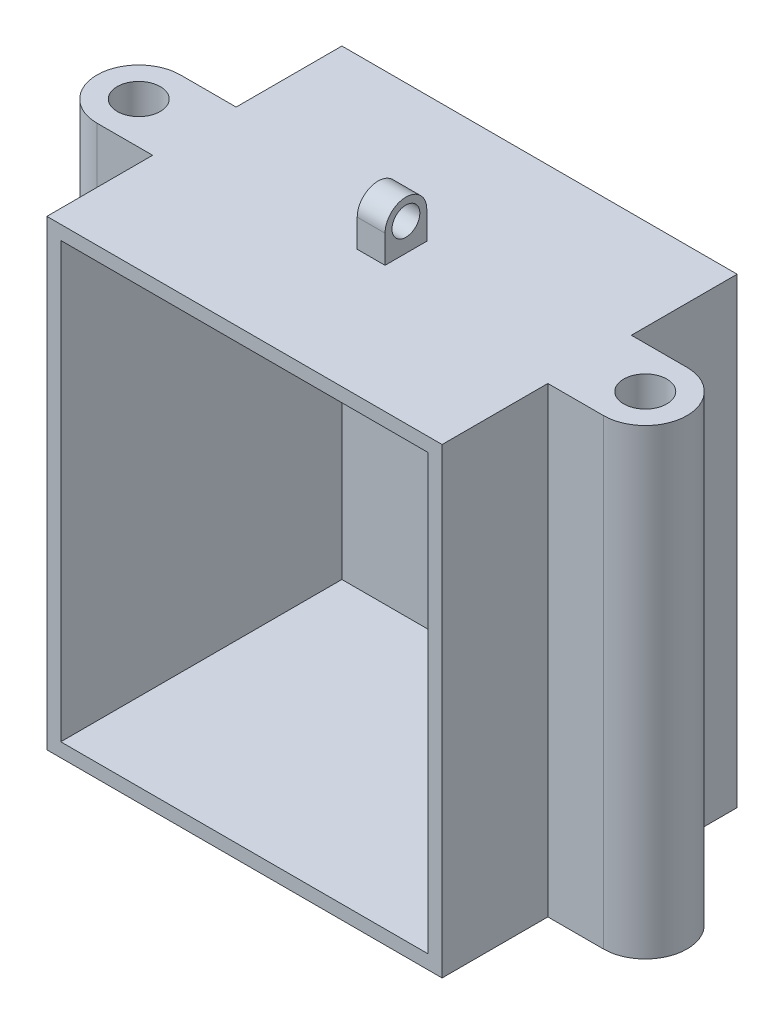
ISO-10303-21;
HEADER;
FILE_DESCRIPTION(('STEP AP214'),'2;1');
FILE_NAME('part.step','',(''),(''),'','','');
FILE_SCHEMA(('AUTOMOTIVE_DESIGN { 1 0 10303 214 1 1 1 1 }'));
ENDSEC;
DATA;
#1=APPLICATION_CONTEXT('core data for automotive mechanical design processes');
#2=APPLICATION_PROTOCOL_DEFINITION('international standard','automotive_design',2000,#1);
#3=PRODUCT_CONTEXT('',#1,'mechanical');
#4=PRODUCT('Part','Part','',(#3));
#5=PRODUCT_RELATED_PRODUCT_CATEGORY('part','',(#4));
#6=PRODUCT_DEFINITION_FORMATION('','',#4);
#7=PRODUCT_DEFINITION_CONTEXT('part definition',#1,'design');
#8=PRODUCT_DEFINITION('design','',#6,#7);
#9=PRODUCT_DEFINITION_SHAPE('','',#8);
#10=(LENGTH_UNIT() NAMED_UNIT(*) SI_UNIT(.MILLI.,.METRE.));
#11=(NAMED_UNIT(*) PLANE_ANGLE_UNIT() SI_UNIT($,.RADIAN.));
#12=(NAMED_UNIT(*) SI_UNIT($,.STERADIAN.) SOLID_ANGLE_UNIT());
#13=UNCERTAINTY_MEASURE_WITH_UNIT(LENGTH_MEASURE(1.E-05),#10,'distance_accuracy_value','');
#14=(GEOMETRIC_REPRESENTATION_CONTEXT(3) GLOBAL_UNCERTAINTY_ASSIGNED_CONTEXT((#13)) GLOBAL_UNIT_ASSIGNED_CONTEXT((#10,
#11,#12)) REPRESENTATION_CONTEXT('',''));
#15=CARTESIAN_POINT('',(0.,0.,0.));
#16=DIRECTION('',(0.,0.,1.));
#17=DIRECTION('',(1.,0.,0.));
#18=AXIS2_PLACEMENT_3D('',#15,#16,#17);
#19=CARTESIAN_POINT('',(0.,166.,106.));
#20=DIRECTION('',(0.,-1.,0.));
#21=DIRECTION('',(0.,0.,-1.));
#22=AXIS2_PLACEMENT_3D('',#19,#20,#21);
#23=PLANE('',#22);
#24=CARTESIAN_POINT('',(162.,166.,53.));
#25=DIRECTION('',(0.,1.,0.));
#26=DIRECTION('',(0.,0.,1.));
#27=AXIS2_PLACEMENT_3D('',#24,#25,#26);
#28=CIRCLE('',#27,7.75);
#29=CARTESIAN_POINT('',(162.,166.,60.75));
#30=VERTEX_POINT('',#29);
#31=EDGE_CURVE('E278',#30,#30,#28,.T.);
#32=ORIENTED_EDGE('',*,*,#31,.F.);
#33=EDGE_LOOP('',(#32));
#34=FACE_BOUND('',#33,.T.);
#35=CARTESIAN_POINT('',(-20.,166.,53.));
#36=DIRECTION('',(0.,1.,0.));
#37=DIRECTION('',(0.,0.,1.));
#38=AXIS2_PLACEMENT_3D('',#35,#36,#37);
#39=CIRCLE('',#38,7.75);
#40=CARTESIAN_POINT('',(-20.,166.,60.75));
#41=VERTEX_POINT('',#40);
#42=EDGE_CURVE('E306',#41,#41,#39,.T.);
#43=ORIENTED_EDGE('',*,*,#42,.F.);
#44=EDGE_LOOP('',(#43));
#45=FACE_BOUND('',#44,.T.);
#46=DIRECTION('',(-1.,0.,0.));
#47=VECTOR('',#46,1.);
#48=CARTESIAN_POINT('',(0.,166.,0.));
#49=LINE('',#48,#47);
#50=CARTESIAN_POINT('',(142.,166.,0.));
#51=VERTEX_POINT('',#50);
#52=CARTESIAN_POINT('',(0.,166.,0.));
#53=VERTEX_POINT('',#52);
#54=EDGE_CURVE('E404',#51,#53,#49,.T.);
#55=ORIENTED_EDGE('',*,*,#54,.T.);
#56=DIRECTION('',(0.,0.,-1.));
#57=VECTOR('',#56,1.);
#58=CARTESIAN_POINT('',(0.,166.,106.));
#59=LINE('',#58,#57);
#60=CARTESIAN_POINT('',(0.,166.,38.));
#61=VERTEX_POINT('',#60);
#62=EDGE_CURVE('E413',#61,#53,#59,.T.);
#63=ORIENTED_EDGE('',*,*,#62,.F.);
#64=DIRECTION('',(1.,0.,0.));
#65=VECTOR('',#64,1.);
#66=CARTESIAN_POINT('',(0.,166.,38.));
#67=LINE('',#66,#65);
#68=CARTESIAN_POINT('',(-20.,166.,38.));
#69=VERTEX_POINT('',#68);
#70=EDGE_CURVE('E320',#69,#61,#67,.T.);
#71=ORIENTED_EDGE('',*,*,#70,.F.);
#72=CARTESIAN_POINT('',(-20.,166.,53.));
#73=DIRECTION('',(0.,1.,0.));
#74=DIRECTION('',(0.,0.,1.));
#75=AXIS2_PLACEMENT_3D('',#72,#73,#74);
#76=CIRCLE('',#75,15.);
#77=CARTESIAN_POINT('',(-20.,166.,68.));
#78=VERTEX_POINT('',#77);
#79=EDGE_CURVE('E334',#69,#78,#76,.T.);
#80=ORIENTED_EDGE('',*,*,#79,.T.);
#81=DIRECTION('',(1.,0.,0.));
#82=VECTOR('',#81,1.);
#83=CARTESIAN_POINT('',(0.,166.,68.));
#84=LINE('',#83,#82);
#85=CARTESIAN_POINT('',(0.,166.,68.));
#86=VERTEX_POINT('',#85);
#87=EDGE_CURVE('E338',#78,#86,#84,.T.);
#88=ORIENTED_EDGE('',*,*,#87,.T.);
#89=CARTESIAN_POINT('',(0.,166.,106.));
#90=VERTEX_POINT('',#89);
#91=EDGE_CURVE('E428',#90,#86,#59,.T.);
#92=ORIENTED_EDGE('',*,*,#91,.F.);
#93=DIRECTION('',(-1.,0.,0.));
#94=VECTOR('',#93,1.);
#95=CARTESIAN_POINT('',(0.,166.,106.));
#96=LINE('',#95,#94);
#97=CARTESIAN_POINT('',(142.,166.,106.));
#98=VERTEX_POINT('',#97);
#99=EDGE_CURVE('E410',#98,#90,#96,.T.);
#100=ORIENTED_EDGE('',*,*,#99,.F.);
#101=DIRECTION('',(0.,0.,-1.));
#102=VECTOR('',#101,1.);
#103=CARTESIAN_POINT('',(142.,166.,106.));
#104=LINE('',#103,#102);
#105=CARTESIAN_POINT('',(142.,166.,68.));
#106=VERTEX_POINT('',#105);
#107=EDGE_CURVE('E433',#98,#106,#104,.T.);
#108=ORIENTED_EDGE('',*,*,#107,.T.);
#109=DIRECTION('',(-1.,0.,0.));
#110=VECTOR('',#109,1.);
#111=CARTESIAN_POINT('',(0.,166.,67.9999999999999));
#112=LINE('',#111,#110);
#113=CARTESIAN_POINT('',(162.,166.,68.));
#114=VERTEX_POINT('',#113);
#115=EDGE_CURVE('E101',#114,#106,#112,.T.);
#116=ORIENTED_EDGE('',*,*,#115,.F.);
#117=CARTESIAN_POINT('',(162.,166.,53.));
#118=DIRECTION('',(0.,1.,0.));
#119=DIRECTION('',(0.,0.,1.));
#120=AXIS2_PLACEMENT_3D('',#117,#118,#119);
#121=CIRCLE('',#120,15.);
#122=CARTESIAN_POINT('',(162.,166.,38.));
#123=VERTEX_POINT('',#122);
#124=EDGE_CURVE('E292',#114,#123,#121,.T.);
#125=ORIENTED_EDGE('',*,*,#124,.T.);
#126=DIRECTION('',(-1.,0.,0.));
#127=VECTOR('',#126,1.);
#128=CARTESIAN_POINT('',(0.,166.,38.0000000000001));
#129=LINE('',#128,#127);
#130=CARTESIAN_POINT('',(142.,166.,38.));
#131=VERTEX_POINT('',#130);
#132=EDGE_CURVE('E296',#123,#131,#129,.T.);
#133=ORIENTED_EDGE('',*,*,#132,.T.);
#134=EDGE_CURVE('E432',#131,#51,#104,.T.);
#135=ORIENTED_EDGE('',*,*,#134,.T.);
#136=EDGE_LOOP('',(#55,#63,#71,#80,#88,#92,#100,#108,#116,#125,#133,#135));
#137=FACE_BOUND('',#136,.T.);
#138=DIRECTION('',(0.,0.,1.));
#139=VECTOR('',#138,1.);
#140=CARTESIAN_POINT('',(66.,166.,0.));
#141=LINE('',#140,#139);
#142=CARTESIAN_POINT('',(66.,166.,45.5));
#143=VERTEX_POINT('',#142);
#144=CARTESIAN_POINT('',(66.,166.,60.5));
#145=VERTEX_POINT('',#144);
#146=EDGE_CURVE('E246',#143,#145,#141,.T.);
#147=ORIENTED_EDGE('',*,*,#146,.F.);
#148=DIRECTION('',(-1.,0.,0.));
#149=VECTOR('',#148,1.);
#150=CARTESIAN_POINT('',(76.,166.,45.5));
#151=LINE('',#150,#149);
#152=CARTESIAN_POINT('',(76.,166.,45.5));
#153=VERTEX_POINT('',#152);
#154=EDGE_CURVE('E259',#153,#143,#151,.T.);
#155=ORIENTED_EDGE('',*,*,#154,.F.);
#156=DIRECTION('',(0.,0.,1.));
#157=VECTOR('',#156,1.);
#158=CARTESIAN_POINT('',(76.,166.,0.));
#159=LINE('',#158,#157);
#160=CARTESIAN_POINT('',(76.,166.,60.5));
#161=VERTEX_POINT('',#160);
#162=EDGE_CURVE('E239',#153,#161,#159,.T.);
#163=ORIENTED_EDGE('',*,*,#162,.T.);
#164=DIRECTION('',(-1.,0.,0.));
#165=VECTOR('',#164,1.);
#166=CARTESIAN_POINT('',(76.,166.,60.5));
#167=LINE('',#166,#165);
#168=EDGE_CURVE('E93',#161,#145,#167,.T.);
#169=ORIENTED_EDGE('',*,*,#168,.T.);
#170=EDGE_LOOP('',(#147,#155,#163,#169));
#171=FACE_BOUND('',#170,.T.);
#172=ADVANCED_FACE('F77',(#34,#45,#137,#171),#23,.F.);
#173=CARTESIAN_POINT('',(142.,0.,106.));
#174=DIRECTION('',(-1.,0.,0.));
#175=DIRECTION('',(0.,0.,1.));
#176=AXIS2_PLACEMENT_3D('',#173,#174,#175);
#177=PLANE('',#176);
#178=DIRECTION('',(0.,1.,0.));
#179=VECTOR('',#178,1.);
#180=CARTESIAN_POINT('',(142.,0.,38.));
#181=LINE('',#180,#179);
#182=CARTESIAN_POINT('',(142.,0.,38.));
#183=VERTEX_POINT('',#182);
#184=EDGE_CURVE('E307',#183,#131,#181,.T.);
#185=ORIENTED_EDGE('',*,*,#184,.F.);
#186=DIRECTION('',(0.,0.,-1.));
#187=VECTOR('',#186,1.);
#188=CARTESIAN_POINT('',(142.,0.,106.));
#189=LINE('',#188,#187);
#190=CARTESIAN_POINT('',(142.,0.,0.));
#191=VERTEX_POINT('',#190);
#192=EDGE_CURVE('E436',#183,#191,#189,.T.);
#193=ORIENTED_EDGE('',*,*,#192,.T.);
#194=DIRECTION('',(0.,1.,0.));
#195=VECTOR('',#194,1.);
#196=CARTESIAN_POINT('',(142.,0.,0.));
#197=LINE('',#196,#195);
#198=EDGE_CURVE('E421',#191,#51,#197,.T.);
#199=ORIENTED_EDGE('',*,*,#198,.T.);
#200=ORIENTED_EDGE('',*,*,#134,.F.);
#201=EDGE_LOOP('',(#185,#193,#199,#200));
#202=FACE_BOUND('',#201,.T.);
#203=ADVANCED_FACE('F448',(#202),#177,.F.);
#204=CARTESIAN_POINT('',(0.,0.,106.));
#205=DIRECTION('',(1.,0.,0.));
#206=DIRECTION('',(0.,0.,-1.));
#207=AXIS2_PLACEMENT_3D('',#204,#205,#206);
#208=PLANE('',#207);
#209=DIRECTION('',(0.,1.,0.));
#210=VECTOR('',#209,1.);
#211=CARTESIAN_POINT('',(0.,0.,68.));
#212=LINE('',#211,#210);
#213=CARTESIAN_POINT('',(0.,0.,68.));
#214=VERTEX_POINT('',#213);
#215=EDGE_CURVE('E352',#214,#86,#212,.T.);
#216=ORIENTED_EDGE('',*,*,#215,.F.);
#217=DIRECTION('',(0.,0.,-1.));
#218=VECTOR('',#217,1.);
#219=CARTESIAN_POINT('',(0.,0.,106.));
#220=LINE('',#219,#218);
#221=CARTESIAN_POINT('',(0.,0.,106.));
#222=VERTEX_POINT('',#221);
#223=EDGE_CURVE('E12',#222,#214,#220,.T.);
#224=ORIENTED_EDGE('',*,*,#223,.F.);
#225=DIRECTION('',(0.,-1.,0.));
#226=VECTOR('',#225,1.);
#227=CARTESIAN_POINT('',(0.,0.,106.));
#228=LINE('',#227,#226);
#229=EDGE_CURVE('E399',#90,#222,#228,.T.);
#230=ORIENTED_EDGE('',*,*,#229,.F.);
#231=ORIENTED_EDGE('',*,*,#91,.T.);
#232=EDGE_LOOP('',(#216,#224,#230,#231));
#233=FACE_BOUND('',#232,.T.);
#234=ADVANCED_FACE('F486',(#233),#208,.F.);
#235=CARTESIAN_POINT('',(0.,0.,106.));
#236=DIRECTION('',(0.,0.,-1.));
#237=DIRECTION('',(-1.,0.,0.));
#238=AXIS2_PLACEMENT_3D('',#235,#236,#237);
#239=PLANE('',#238);
#240=ORIENTED_EDGE('',*,*,#229,.T.);
#241=DIRECTION('',(1.,0.,0.));
#242=VECTOR('',#241,1.);
#243=CARTESIAN_POINT('',(0.,0.,106.));
#244=LINE('',#243,#242);
#245=CARTESIAN_POINT('',(142.,0.,106.));
#246=VERTEX_POINT('',#245);
#247=EDGE_CURVE('E403',#222,#246,#244,.T.);
#248=ORIENTED_EDGE('',*,*,#247,.T.);
#249=DIRECTION('',(0.,1.,0.));
#250=VECTOR('',#249,1.);
#251=CARTESIAN_POINT('',(142.,0.,106.));
#252=LINE('',#251,#250);
#253=EDGE_CURVE('E407',#246,#98,#252,.T.);
#254=ORIENTED_EDGE('',*,*,#253,.T.);
#255=ORIENTED_EDGE('',*,*,#99,.T.);
#256=EDGE_LOOP('',(#240,#248,#254,#255));
#257=FACE_BOUND('',#256,.T.);
#258=DIRECTION('',(0.,-1.,0.));
#259=VECTOR('',#258,1.);
#260=CARTESIAN_POINT('',(5.,0.,106.));
#261=LINE('',#260,#259);
#262=CARTESIAN_POINT('',(5.,161.,106.));
#263=VERTEX_POINT('',#262);
#264=CARTESIAN_POINT('',(5.,5.,106.));
#265=VERTEX_POINT('',#264);
#266=EDGE_CURVE('E387',#263,#265,#261,.T.);
#267=ORIENTED_EDGE('',*,*,#266,.F.);
#268=DIRECTION('',(-1.,0.,0.));
#269=VECTOR('',#268,1.);
#270=CARTESIAN_POINT('',(0.,161.,106.));
#271=LINE('',#270,#269);
#272=CARTESIAN_POINT('',(137.,161.,106.));
#273=VERTEX_POINT('',#272);
#274=EDGE_CURVE('E372',#273,#263,#271,.T.);
#275=ORIENTED_EDGE('',*,*,#274,.F.);
#276=DIRECTION('',(0.,1.,0.));
#277=VECTOR('',#276,1.);
#278=CARTESIAN_POINT('',(137.,0.,106.));
#279=LINE('',#278,#277);
#280=CARTESIAN_POINT('',(137.,5.,106.));
#281=VERTEX_POINT('',#280);
#282=EDGE_CURVE('E393',#281,#273,#279,.T.);
#283=ORIENTED_EDGE('',*,*,#282,.F.);
#284=DIRECTION('',(1.,0.,0.));
#285=VECTOR('',#284,1.);
#286=CARTESIAN_POINT('',(0.,5.,106.));
#287=LINE('',#286,#285);
#288=EDGE_CURVE('E390',#265,#281,#287,.T.);
#289=ORIENTED_EDGE('',*,*,#288,.F.);
#290=EDGE_LOOP('',(#267,#275,#283,#289));
#291=FACE_BOUND('',#290,.T.);
#292=ADVANCED_FACE('F489',(#257,#291),#239,.F.);
#293=CARTESIAN_POINT('',(0.,0.,38.));
#294=VERTEX_POINT('',#293);
#295=CARTESIAN_POINT('',(0.,0.,0.));
#296=VERTEX_POINT('',#295);
#297=EDGE_CURVE('E86',#294,#296,#220,.T.);
#298=ORIENTED_EDGE('',*,*,#297,.F.);
#299=DIRECTION('',(0.,1.,0.));
#300=VECTOR('',#299,1.);
#301=CARTESIAN_POINT('',(0.,0.,38.));
#302=LINE('',#301,#300);
#303=EDGE_CURVE('E348',#294,#61,#302,.T.);
#304=ORIENTED_EDGE('',*,*,#303,.T.);
#305=ORIENTED_EDGE('',*,*,#62,.T.);
#306=DIRECTION('',(0.,-1.,0.));
#307=VECTOR('',#306,1.);
#308=CARTESIAN_POINT('',(0.,0.,0.));
#309=LINE('',#308,#307);
#310=EDGE_CURVE('E365',#53,#296,#309,.T.);
#311=ORIENTED_EDGE('',*,*,#310,.T.);
#312=EDGE_LOOP('',(#298,#304,#305,#311));
#313=FACE_BOUND('',#312,.T.);
#314=ADVANCED_FACE('F79',(#313),#208,.F.);
#315=CARTESIAN_POINT('',(0.,0.,106.));
#316=DIRECTION('',(0.,1.,0.));
#317=DIRECTION('',(0.,0.,1.));
#318=AXIS2_PLACEMENT_3D('',#315,#316,#317);
#319=PLANE('',#318);
#320=DIRECTION('',(1.,0.,0.));
#321=VECTOR('',#320,1.);
#322=CARTESIAN_POINT('',(0.,0.,0.));
#323=LINE('',#322,#321);
#324=EDGE_CURVE('E417',#296,#191,#323,.T.);
#325=ORIENTED_EDGE('',*,*,#324,.T.);
#326=ORIENTED_EDGE('',*,*,#192,.F.);
#327=DIRECTION('',(-1.,0.,0.));
#328=VECTOR('',#327,1.);
#329=CARTESIAN_POINT('',(0.,0.,38.0000000000001));
#330=LINE('',#329,#328);
#331=CARTESIAN_POINT('',(162.,0.,38.));
#332=VERTEX_POINT('',#331);
#333=EDGE_CURVE('E282',#332,#183,#330,.T.);
#334=ORIENTED_EDGE('',*,*,#333,.F.);
#335=CARTESIAN_POINT('',(162.,0.,53.));
#336=DIRECTION('',(0.,1.,0.));
#337=DIRECTION('',(0.,0.,1.));
#338=AXIS2_PLACEMENT_3D('',#335,#336,#337);
#339=CIRCLE('',#338,15.);
#340=CARTESIAN_POINT('',(162.,0.,68.));
#341=VERTEX_POINT('',#340);
#342=EDGE_CURVE('E277',#341,#332,#339,.T.);
#343=ORIENTED_EDGE('',*,*,#342,.F.);
#344=DIRECTION('',(-1.,0.,0.));
#345=VECTOR('',#344,1.);
#346=CARTESIAN_POINT('',(0.,0.,67.9999999999999));
#347=LINE('',#346,#345);
#348=CARTESIAN_POINT('',(142.,0.,68.));
#349=VERTEX_POINT('',#348);
#350=EDGE_CURVE('E274',#341,#349,#347,.T.);
#351=ORIENTED_EDGE('',*,*,#350,.T.);
#352=EDGE_CURVE('E437',#246,#349,#189,.T.);
#353=ORIENTED_EDGE('',*,*,#352,.F.);
#354=ORIENTED_EDGE('',*,*,#247,.F.);
#355=ORIENTED_EDGE('',*,*,#223,.T.);
#356=DIRECTION('',(1.,0.,0.));
#357=VECTOR('',#356,1.);
#358=CARTESIAN_POINT('',(0.,0.,68.));
#359=LINE('',#358,#357);
#360=CARTESIAN_POINT('',(-20.,0.,68.));
#361=VERTEX_POINT('',#360);
#362=EDGE_CURVE('E324',#361,#214,#359,.T.);
#363=ORIENTED_EDGE('',*,*,#362,.F.);
#364=CARTESIAN_POINT('',(-20.,0.,53.));
#365=DIRECTION('',(0.,1.,0.));
#366=DIRECTION('',(0.,0.,1.));
#367=AXIS2_PLACEMENT_3D('',#364,#365,#366);
#368=CIRCLE('',#367,15.);
#369=CARTESIAN_POINT('',(-20.,0.,38.));
#370=VERTEX_POINT('',#369);
#371=EDGE_CURVE('E319',#370,#361,#368,.T.);
#372=ORIENTED_EDGE('',*,*,#371,.F.);
#373=DIRECTION('',(1.,0.,0.));
#374=VECTOR('',#373,1.);
#375=CARTESIAN_POINT('',(0.,0.,38.));
#376=LINE('',#375,#374);
#377=EDGE_CURVE('E327',#370,#294,#376,.T.);
#378=ORIENTED_EDGE('',*,*,#377,.T.);
#379=ORIENTED_EDGE('',*,*,#297,.T.);
#380=EDGE_LOOP('',(#325,#326,#334,#343,#351,#353,#354,#355,#363,#372,#378,#379));
#381=FACE_BOUND('',#380,.T.);
#382=CARTESIAN_POINT('',(-20.,0.,53.));
#383=DIRECTION('',(0.,1.,0.));
#384=DIRECTION('',(0.,0.,1.));
#385=AXIS2_PLACEMENT_3D('',#382,#383,#384);
#386=CIRCLE('',#385,7.75);
#387=CARTESIAN_POINT('',(-20.,0.,60.75));
#388=VERTEX_POINT('',#387);
#389=EDGE_CURVE('E315',#388,#388,#386,.T.);
#390=ORIENTED_EDGE('',*,*,#389,.T.);
#391=EDGE_LOOP('',(#390));
#392=FACE_BOUND('',#391,.T.);
#393=CARTESIAN_POINT('',(162.,0.,53.));
#394=DIRECTION('',(0.,1.,0.));
#395=DIRECTION('',(0.,0.,1.));
#396=AXIS2_PLACEMENT_3D('',#393,#394,#395);
#397=CIRCLE('',#396,7.75);
#398=CARTESIAN_POINT('',(162.,0.,60.75));
#399=VERTEX_POINT('',#398);
#400=EDGE_CURVE('E285',#399,#399,#397,.T.);
#401=ORIENTED_EDGE('',*,*,#400,.T.);
#402=EDGE_LOOP('',(#401));
#403=FACE_BOUND('',#402,.T.);
#404=ADVANCED_FACE('F455',(#381,#392,#403),#319,.F.);
#405=ORIENTED_EDGE('',*,*,#352,.T.);
#406=DIRECTION('',(0.,1.,0.));
#407=VECTOR('',#406,1.);
#408=CARTESIAN_POINT('',(142.,0.,68.));
#409=LINE('',#408,#407);
#410=EDGE_CURVE('E303',#349,#106,#409,.T.);
#411=ORIENTED_EDGE('',*,*,#410,.T.);
#412=ORIENTED_EDGE('',*,*,#107,.F.);
#413=ORIENTED_EDGE('',*,*,#253,.F.);
#414=EDGE_LOOP('',(#405,#411,#412,#413));
#415=FACE_BOUND('',#414,.T.);
#416=ADVANCED_FACE('F493',(#415),#177,.F.);
#417=CARTESIAN_POINT('',(0.,0.,0.));
#418=DIRECTION('',(0.,0.,-1.));
#419=DIRECTION('',(-1.,0.,0.));
#420=AXIS2_PLACEMENT_3D('',#417,#418,#419);
#421=PLANE('',#420);
#422=ORIENTED_EDGE('',*,*,#310,.F.);
#423=ORIENTED_EDGE('',*,*,#54,.F.);
#424=ORIENTED_EDGE('',*,*,#198,.F.);
#425=ORIENTED_EDGE('',*,*,#324,.F.);
#426=EDGE_LOOP('',(#422,#423,#424,#425));
#427=FACE_BOUND('',#426,.T.);
#428=ADVANCED_FACE('F460',(#427),#421,.T.);
#429=CARTESIAN_POINT('',(5.,0.,106.));
#430=DIRECTION('',(1.,0.,0.));
#431=DIRECTION('',(0.,0.,-1.));
#432=AXIS2_PLACEMENT_3D('',#429,#430,#431);
#433=PLANE('',#432);
#434=DIRECTION('',(0.,-1.,0.));
#435=VECTOR('',#434,1.);
#436=CARTESIAN_POINT('',(5.,0.,5.));
#437=LINE('',#436,#435);
#438=CARTESIAN_POINT('',(5.,161.,5.));
#439=VERTEX_POINT('',#438);
#440=CARTESIAN_POINT('',(5.,5.,5.));
#441=VERTEX_POINT('',#440);
#442=EDGE_CURVE('E347',#439,#441,#437,.T.);
#443=ORIENTED_EDGE('',*,*,#442,.F.);
#444=DIRECTION('',(0.,0.,-1.));
#445=VECTOR('',#444,1.);
#446=CARTESIAN_POINT('',(5.,161.,106.));
#447=LINE('',#446,#445);
#448=EDGE_CURVE('E367',#263,#439,#447,.T.);
#449=ORIENTED_EDGE('',*,*,#448,.F.);
#450=ORIENTED_EDGE('',*,*,#266,.T.);
#451=DIRECTION('',(0.,0.,-1.));
#452=VECTOR('',#451,1.);
#453=CARTESIAN_POINT('',(5.,5.,106.));
#454=LINE('',#453,#452);
#455=EDGE_CURVE('E361',#265,#441,#454,.T.);
#456=ORIENTED_EDGE('',*,*,#455,.T.);
#457=EDGE_LOOP('',(#443,#449,#450,#456));
#458=FACE_BOUND('',#457,.T.);
#459=ADVANCED_FACE('F576',(#458),#433,.T.);
#460=CARTESIAN_POINT('',(0.,5.,106.));
#461=DIRECTION('',(0.,1.,0.));
#462=DIRECTION('',(0.,0.,1.));
#463=AXIS2_PLACEMENT_3D('',#460,#461,#462);
#464=PLANE('',#463);
#465=DIRECTION('',(1.,0.,0.));
#466=VECTOR('',#465,1.);
#467=CARTESIAN_POINT('',(0.,5.,5.));
#468=LINE('',#467,#466);
#469=CARTESIAN_POINT('',(137.,5.,5.));
#470=VERTEX_POINT('',#469);
#471=EDGE_CURVE('E360',#441,#470,#468,.T.);
#472=ORIENTED_EDGE('',*,*,#471,.F.);
#473=ORIENTED_EDGE('',*,*,#455,.F.);
#474=ORIENTED_EDGE('',*,*,#288,.T.);
#475=DIRECTION('',(0.,0.,-1.));
#476=VECTOR('',#475,1.);
#477=CARTESIAN_POINT('',(137.,5.,106.));
#478=LINE('',#477,#476);
#479=EDGE_CURVE('E366',#281,#470,#478,.T.);
#480=ORIENTED_EDGE('',*,*,#479,.T.);
#481=EDGE_LOOP('',(#472,#473,#474,#480));
#482=FACE_BOUND('',#481,.T.);
#483=ADVANCED_FACE('F566',(#482),#464,.T.);
#484=CARTESIAN_POINT('',(137.,0.,106.));
#485=DIRECTION('',(-1.,0.,0.));
#486=DIRECTION('',(0.,0.,1.));
#487=AXIS2_PLACEMENT_3D('',#484,#485,#486);
#488=PLANE('',#487);
#489=DIRECTION('',(0.,1.,0.));
#490=VECTOR('',#489,1.);
#491=CARTESIAN_POINT('',(137.,0.,5.));
#492=LINE('',#491,#490);
#493=CARTESIAN_POINT('',(137.,161.,5.));
#494=VERTEX_POINT('',#493);
#495=EDGE_CURVE('E375',#470,#494,#492,.T.);
#496=ORIENTED_EDGE('',*,*,#495,.F.);
#497=ORIENTED_EDGE('',*,*,#479,.F.);
#498=ORIENTED_EDGE('',*,*,#282,.T.);
#499=DIRECTION('',(0.,0.,-1.));
#500=VECTOR('',#499,1.);
#501=CARTESIAN_POINT('',(137.,161.,106.));
#502=LINE('',#501,#500);
#503=EDGE_CURVE('E371',#273,#494,#502,.T.);
#504=ORIENTED_EDGE('',*,*,#503,.T.);
#505=EDGE_LOOP('',(#496,#497,#498,#504));
#506=FACE_BOUND('',#505,.T.);
#507=ADVANCED_FACE('F556',(#506),#488,.T.);
#508=CARTESIAN_POINT('',(0.,161.,106.));
#509=DIRECTION('',(0.,-1.,0.));
#510=DIRECTION('',(0.,0.,-1.));
#511=AXIS2_PLACEMENT_3D('',#508,#509,#510);
#512=PLANE('',#511);
#513=DIRECTION('',(-1.,0.,0.));
#514=VECTOR('',#513,1.);
#515=CARTESIAN_POINT('',(0.,161.,5.));
#516=LINE('',#515,#514);
#517=EDGE_CURVE('E381',#494,#439,#516,.T.);
#518=ORIENTED_EDGE('',*,*,#517,.F.);
#519=ORIENTED_EDGE('',*,*,#503,.F.);
#520=ORIENTED_EDGE('',*,*,#274,.T.);
#521=ORIENTED_EDGE('',*,*,#448,.T.);
#522=EDGE_LOOP('',(#518,#519,#520,#521));
#523=FACE_BOUND('',#522,.T.);
#524=ADVANCED_FACE('F546',(#523),#512,.T.);
#525=CARTESIAN_POINT('',(0.,0.,5.));
#526=DIRECTION('',(0.,0.,-1.));
#527=DIRECTION('',(-1.,0.,0.));
#528=AXIS2_PLACEMENT_3D('',#525,#526,#527);
#529=PLANE('',#528);
#530=ORIENTED_EDGE('',*,*,#442,.T.);
#531=ORIENTED_EDGE('',*,*,#471,.T.);
#532=ORIENTED_EDGE('',*,*,#495,.T.);
#533=ORIENTED_EDGE('',*,*,#517,.T.);
#534=EDGE_LOOP('',(#530,#531,#532,#533));
#535=FACE_BOUND('',#534,.T.);
#536=ADVANCED_FACE('F542',(#535),#529,.F.);
#537=CARTESIAN_POINT('',(-20.,0.,53.));
#538=DIRECTION('',(0.,1.,0.));
#539=DIRECTION('',(0.,0.,1.));
#540=AXIS2_PLACEMENT_3D('',#537,#538,#539);
#541=CYLINDRICAL_SURFACE('',#540,15.);
#542=ORIENTED_EDGE('',*,*,#79,.F.);
#543=DIRECTION('',(0.,1.,0.));
#544=VECTOR('',#543,1.);
#545=CARTESIAN_POINT('',(-20.,0.,38.));
#546=LINE('',#545,#544);
#547=EDGE_CURVE('E344',#370,#69,#546,.T.);
#548=ORIENTED_EDGE('',*,*,#547,.F.);
#549=ORIENTED_EDGE('',*,*,#371,.T.);
#550=DIRECTION('',(0.,1.,0.));
#551=VECTOR('',#550,1.);
#552=CARTESIAN_POINT('',(-20.,0.,68.));
#553=LINE('',#552,#551);
#554=EDGE_CURVE('E330',#361,#78,#553,.T.);
#555=ORIENTED_EDGE('',*,*,#554,.T.);
#556=EDGE_LOOP('',(#542,#548,#549,#555));
#557=FACE_BOUND('',#556,.T.);
#558=ADVANCED_FACE('F476',(#557),#541,.T.);
#559=CARTESIAN_POINT('',(0.,0.,38.));
#560=DIRECTION('',(0.,0.,1.));
#561=DIRECTION('',(1.,0.,0.));
#562=AXIS2_PLACEMENT_3D('',#559,#560,#561);
#563=PLANE('',#562);
#564=ORIENTED_EDGE('',*,*,#70,.T.);
#565=ORIENTED_EDGE('',*,*,#303,.F.);
#566=ORIENTED_EDGE('',*,*,#377,.F.);
#567=ORIENTED_EDGE('',*,*,#547,.T.);
#568=EDGE_LOOP('',(#564,#565,#566,#567));
#569=FACE_BOUND('',#568,.T.);
#570=ADVANCED_FACE('F472',(#569),#563,.F.);
#571=CARTESIAN_POINT('',(-20.,0.,53.));
#572=DIRECTION('',(0.,1.,0.));
#573=DIRECTION('',(0.,0.,1.));
#574=AXIS2_PLACEMENT_3D('',#571,#572,#573);
#575=CYLINDRICAL_SURFACE('',#574,7.75);
#576=ORIENTED_EDGE('',*,*,#389,.F.);
#577=EDGE_LOOP('',(#576));
#578=FACE_BOUND('',#577,.T.);
#579=ORIENTED_EDGE('',*,*,#42,.T.);
#580=EDGE_LOOP('',(#579));
#581=FACE_BOUND('',#580,.T.);
#582=ADVANCED_FACE('F645',(#578,#581),#575,.F.);
#583=CARTESIAN_POINT('',(0.,0.,68.));
#584=DIRECTION('',(0.,0.,1.));
#585=DIRECTION('',(1.,0.,0.));
#586=AXIS2_PLACEMENT_3D('',#583,#584,#585);
#587=PLANE('',#586);
#588=ORIENTED_EDGE('',*,*,#87,.F.);
#589=ORIENTED_EDGE('',*,*,#554,.F.);
#590=ORIENTED_EDGE('',*,*,#362,.T.);
#591=ORIENTED_EDGE('',*,*,#215,.T.);
#592=EDGE_LOOP('',(#588,#589,#590,#591));
#593=FACE_BOUND('',#592,.T.);
#594=ADVANCED_FACE('F480',(#593),#587,.T.);
#595=CARTESIAN_POINT('',(0.,0.,67.9999999999999));
#596=DIRECTION('',(0.,0.,-1.));
#597=DIRECTION('',(-1.,0.,0.));
#598=AXIS2_PLACEMENT_3D('',#595,#596,#597);
#599=PLANE('',#598);
#600=ORIENTED_EDGE('',*,*,#115,.T.);
#601=ORIENTED_EDGE('',*,*,#410,.F.);
#602=ORIENTED_EDGE('',*,*,#350,.F.);
#603=DIRECTION('',(0.,1.,0.));
#604=VECTOR('',#603,1.);
#605=CARTESIAN_POINT('',(162.,0.,68.));
#606=LINE('',#605,#604);
#607=EDGE_CURVE('E289',#341,#114,#606,.T.);
#608=ORIENTED_EDGE('',*,*,#607,.T.);
#609=EDGE_LOOP('',(#600,#601,#602,#608));
#610=FACE_BOUND('',#609,.T.);
#611=ADVANCED_FACE('F495',(#610),#599,.F.);
#612=CARTESIAN_POINT('',(0.,0.,38.0000000000001));
#613=DIRECTION('',(0.,0.,-1.));
#614=DIRECTION('',(-1.,0.,0.));
#615=AXIS2_PLACEMENT_3D('',#612,#613,#614);
#616=PLANE('',#615);
#617=ORIENTED_EDGE('',*,*,#132,.F.);
#618=DIRECTION('',(0.,1.,0.));
#619=VECTOR('',#618,1.);
#620=CARTESIAN_POINT('',(162.,0.,38.));
#621=LINE('',#620,#619);
#622=EDGE_CURVE('E310',#332,#123,#621,.T.);
#623=ORIENTED_EDGE('',*,*,#622,.F.);
#624=ORIENTED_EDGE('',*,*,#333,.T.);
#625=ORIENTED_EDGE('',*,*,#184,.T.);
#626=EDGE_LOOP('',(#617,#623,#624,#625));
#627=FACE_BOUND('',#626,.T.);
#628=ADVANCED_FACE('F500',(#627),#616,.T.);
#629=CARTESIAN_POINT('',(162.,0.,53.));
#630=DIRECTION('',(0.,1.,0.));
#631=DIRECTION('',(0.,0.,1.));
#632=AXIS2_PLACEMENT_3D('',#629,#630,#631);
#633=CYLINDRICAL_SURFACE('',#632,15.);
#634=ORIENTED_EDGE('',*,*,#124,.F.);
#635=ORIENTED_EDGE('',*,*,#607,.F.);
#636=ORIENTED_EDGE('',*,*,#342,.T.);
#637=ORIENTED_EDGE('',*,*,#622,.T.);
#638=EDGE_LOOP('',(#634,#635,#636,#637));
#639=FACE_BOUND('',#638,.T.);
#640=ADVANCED_FACE('F498',(#639),#633,.T.);
#641=CARTESIAN_POINT('',(162.,0.,53.));
#642=DIRECTION('',(0.,1.,0.));
#643=DIRECTION('',(0.,0.,1.));
#644=AXIS2_PLACEMENT_3D('',#641,#642,#643);
#645=CYLINDRICAL_SURFACE('',#644,7.75);
#646=ORIENTED_EDGE('',*,*,#400,.F.);
#647=EDGE_LOOP('',(#646));
#648=FACE_BOUND('',#647,.T.);
#649=ORIENTED_EDGE('',*,*,#31,.T.);
#650=EDGE_LOOP('',(#649));
#651=FACE_BOUND('',#650,.T.);
#652=ADVANCED_FACE('F507',(#648,#651),#645,.F.);
#653=CARTESIAN_POINT('',(76.,0.,60.5));
#654=DIRECTION('',(0.,0.,-1.));
#655=DIRECTION('',(-1.,0.,0.));
#656=AXIS2_PLACEMENT_3D('',#653,#654,#655);
#657=PLANE('',#656);
#658=DIRECTION('',(0.,-1.,0.));
#659=VECTOR('',#658,1.);
#660=CARTESIAN_POINT('',(66.,0.,60.5));
#661=LINE('',#660,#659);
#662=CARTESIAN_POINT('',(66.,176.,60.5));
#663=VERTEX_POINT('',#662);
#664=EDGE_CURVE('E235',#663,#145,#661,.T.);
#665=ORIENTED_EDGE('',*,*,#664,.T.);
#666=ORIENTED_EDGE('',*,*,#168,.F.);
#667=DIRECTION('',(0.,-1.,0.));
#668=VECTOR('',#667,1.);
#669=CARTESIAN_POINT('',(76.,0.,60.5));
#670=LINE('',#669,#668);
#671=CARTESIAN_POINT('',(76.,176.,60.5));
#672=VERTEX_POINT('',#671);
#673=EDGE_CURVE('E230',#672,#161,#670,.T.);
#674=ORIENTED_EDGE('',*,*,#673,.F.);
#675=DIRECTION('',(-1.,0.,0.));
#676=VECTOR('',#675,1.);
#677=CARTESIAN_POINT('',(76.,176.,60.5));
#678=LINE('',#677,#676);
#679=EDGE_CURVE('E217',#672,#663,#678,.T.);
#680=ORIENTED_EDGE('',*,*,#679,.T.);
#681=EDGE_LOOP('',(#665,#666,#674,#680));
#682=FACE_BOUND('',#681,.T.);
#683=ADVANCED_FACE('F237',(#682),#657,.F.);
#684=CARTESIAN_POINT('',(76.,0.,45.5));
#685=DIRECTION('',(0.,0.,-1.));
#686=DIRECTION('',(-1.,0.,0.));
#687=AXIS2_PLACEMENT_3D('',#684,#685,#686);
#688=PLANE('',#687);
#689=DIRECTION('',(0.,-1.,0.));
#690=VECTOR('',#689,1.);
#691=CARTESIAN_POINT('',(66.,0.,45.5));
#692=LINE('',#691,#690);
#693=CARTESIAN_POINT('',(66.,176.,45.5));
#694=VERTEX_POINT('',#693);
#695=EDGE_CURVE('E240',#694,#143,#692,.T.);
#696=ORIENTED_EDGE('',*,*,#695,.F.);
#697=DIRECTION('',(-1.,0.,0.));
#698=VECTOR('',#697,1.);
#699=CARTESIAN_POINT('',(76.,176.,45.5));
#700=LINE('',#699,#698);
#701=CARTESIAN_POINT('',(76.,176.,45.5));
#702=VERTEX_POINT('',#701);
#703=EDGE_CURVE('E251',#702,#694,#700,.T.);
#704=ORIENTED_EDGE('',*,*,#703,.F.);
#705=DIRECTION('',(0.,-1.,0.));
#706=VECTOR('',#705,1.);
#707=CARTESIAN_POINT('',(76.,0.,45.5));
#708=LINE('',#707,#706);
#709=EDGE_CURVE('E233',#702,#153,#708,.T.);
#710=ORIENTED_EDGE('',*,*,#709,.T.);
#711=ORIENTED_EDGE('',*,*,#154,.T.);
#712=EDGE_LOOP('',(#696,#704,#710,#711));
#713=FACE_BOUND('',#712,.T.);
#714=ADVANCED_FACE('F705',(#713),#688,.T.);
#715=CARTESIAN_POINT('',(66.,0.,0.));
#716=DIRECTION('',(1.,0.,0.));
#717=DIRECTION('',(0.,0.,-1.));
#718=AXIS2_PLACEMENT_3D('',#715,#716,#717);
#719=PLANE('',#718);
#720=ORIENTED_EDGE('',*,*,#664,.F.);
#721=CARTESIAN_POINT('',(66.,176.,53.));
#722=DIRECTION('',(1.,0.,0.));
#723=DIRECTION('',(0.,0.,-1.));
#724=AXIS2_PLACEMENT_3D('',#721,#722,#723);
#725=CIRCLE('',#724,7.5);
#726=EDGE_CURVE('E223',#694,#663,#725,.T.);
#727=ORIENTED_EDGE('',*,*,#726,.F.);
#728=ORIENTED_EDGE('',*,*,#695,.T.);
#729=ORIENTED_EDGE('',*,*,#146,.T.);
#730=EDGE_LOOP('',(#720,#727,#728,#729));
#731=FACE_BOUND('',#730,.T.);
#732=CARTESIAN_POINT('',(66.,176.,53.));
#733=DIRECTION('',(1.,0.,0.));
#734=DIRECTION('',(0.,0.,-1.));
#735=AXIS2_PLACEMENT_3D('',#732,#733,#734);
#736=CIRCLE('',#735,5.);
#737=CARTESIAN_POINT('',(66.,176.,48.));
#738=VERTEX_POINT('',#737);
#739=EDGE_CURVE('E268',#738,#738,#736,.T.);
#740=ORIENTED_EDGE('',*,*,#739,.T.);
#741=EDGE_LOOP('',(#740));
#742=FACE_BOUND('',#741,.T.);
#743=ADVANCED_FACE('F713',(#731,#742),#719,.F.);
#744=CARTESIAN_POINT('',(76.,0.,0.));
#745=DIRECTION('',(1.,0.,0.));
#746=DIRECTION('',(0.,0.,-1.));
#747=AXIS2_PLACEMENT_3D('',#744,#745,#746);
#748=PLANE('',#747);
#749=ORIENTED_EDGE('',*,*,#709,.F.);
#750=CARTESIAN_POINT('',(76.,176.,53.));
#751=DIRECTION('',(1.,0.,0.));
#752=DIRECTION('',(0.,0.,-1.));
#753=AXIS2_PLACEMENT_3D('',#750,#751,#752);
#754=CIRCLE('',#753,7.5);
#755=EDGE_CURVE('E220',#702,#672,#754,.T.);
#756=ORIENTED_EDGE('',*,*,#755,.T.);
#757=ORIENTED_EDGE('',*,*,#673,.T.);
#758=ORIENTED_EDGE('',*,*,#162,.F.);
#759=EDGE_LOOP('',(#749,#756,#757,#758));
#760=FACE_BOUND('',#759,.T.);
#761=CARTESIAN_POINT('',(76.,176.,53.));
#762=DIRECTION('',(1.,0.,0.));
#763=DIRECTION('',(0.,0.,-1.));
#764=AXIS2_PLACEMENT_3D('',#761,#762,#763);
#765=CIRCLE('',#764,5.);
#766=CARTESIAN_POINT('',(76.,176.,48.));
#767=VERTEX_POINT('',#766);
#768=EDGE_CURVE('E264',#767,#767,#765,.T.);
#769=ORIENTED_EDGE('',*,*,#768,.F.);
#770=EDGE_LOOP('',(#769));
#771=FACE_BOUND('',#770,.T.);
#772=ADVANCED_FACE('F228',(#760,#771),#748,.T.);
#773=CARTESIAN_POINT('',(76.,176.,53.));
#774=DIRECTION('',(-1.,0.,0.));
#775=DIRECTION('',(0.,0.,1.));
#776=AXIS2_PLACEMENT_3D('',#773,#774,#775);
#777=CYLINDRICAL_SURFACE('',#776,5.);
#778=ORIENTED_EDGE('',*,*,#768,.T.);
#779=EDGE_LOOP('',(#778));
#780=FACE_BOUND('',#779,.T.);
#781=ORIENTED_EDGE('',*,*,#739,.F.);
#782=EDGE_LOOP('',(#781));
#783=FACE_BOUND('',#782,.T.);
#784=ADVANCED_FACE('F733',(#780,#783),#777,.F.);
#785=CARTESIAN_POINT('',(76.,176.,53.));
#786=DIRECTION('',(-1.,0.,0.));
#787=DIRECTION('',(0.,0.,1.));
#788=AXIS2_PLACEMENT_3D('',#785,#786,#787);
#789=CYLINDRICAL_SURFACE('',#788,7.5);
#790=ORIENTED_EDGE('',*,*,#726,.T.);
#791=ORIENTED_EDGE('',*,*,#679,.F.);
#792=ORIENTED_EDGE('',*,*,#755,.F.);
#793=ORIENTED_EDGE('',*,*,#703,.T.);
#794=EDGE_LOOP('',(#790,#791,#792,#793));
#795=FACE_BOUND('',#794,.T.);
#796=ADVANCED_FACE('F219',(#795),#789,.T.);
#797=CLOSED_SHELL('',(#172,#203,#234,#292,#314,#404,#416,#428,#459,#483,#507,#524,#536,#558,
#570,#582,#594,#611,#628,#640,#652,#683,#714,#743,#772,#784,#796));
#798=MANIFOLD_SOLID_BREP('B2',#797);
#799=ADVANCED_BREP_SHAPE_REPRESENTATION('',(#18,#798),#14);
#800=SHAPE_DEFINITION_REPRESENTATION(#9,#799);
ENDSEC;
END-ISO-10303-21;
